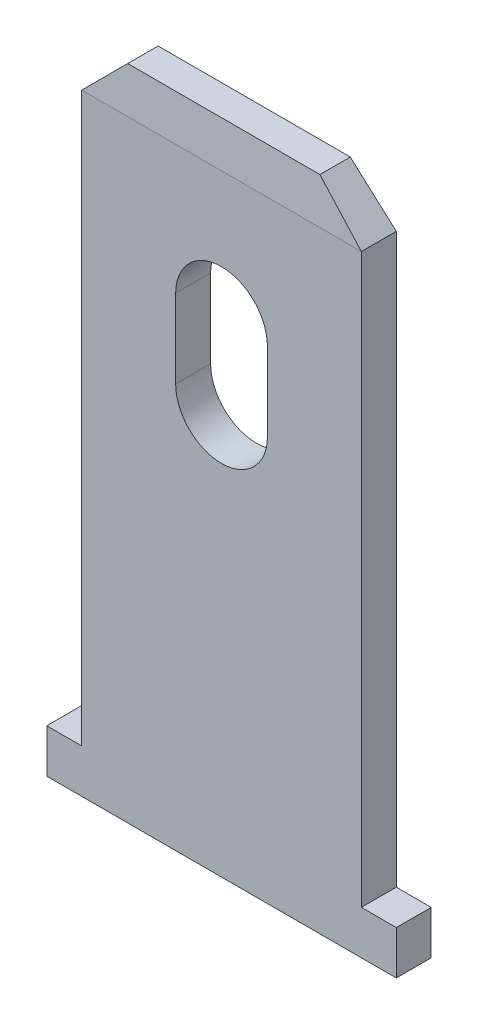
ISO-10303-21;
HEADER;
FILE_DESCRIPTION(('STEP AP214'),'2;1');
FILE_NAME('part.step','',(''),(''),'','','');
FILE_SCHEMA(('AUTOMOTIVE_DESIGN { 1 0 10303 214 1 1 1 1 }'));
ENDSEC;
DATA;
#1=APPLICATION_CONTEXT('core data for automotive mechanical design processes');
#2=APPLICATION_PROTOCOL_DEFINITION('international standard','automotive_design',2000,#1);
#3=PRODUCT_CONTEXT('',#1,'mechanical');
#4=PRODUCT('Part','Part','',(#3));
#5=PRODUCT_RELATED_PRODUCT_CATEGORY('part','',(#4));
#6=PRODUCT_DEFINITION_FORMATION('','',#4);
#7=PRODUCT_DEFINITION_CONTEXT('part definition',#1,'design');
#8=PRODUCT_DEFINITION('design','',#6,#7);
#9=PRODUCT_DEFINITION_SHAPE('','',#8);
#10=(LENGTH_UNIT() NAMED_UNIT(*) SI_UNIT(.MILLI.,.METRE.));
#11=(NAMED_UNIT(*) PLANE_ANGLE_UNIT() SI_UNIT($,.RADIAN.));
#12=(NAMED_UNIT(*) SI_UNIT($,.STERADIAN.) SOLID_ANGLE_UNIT());
#13=UNCERTAINTY_MEASURE_WITH_UNIT(LENGTH_MEASURE(1.E-05),#10,'distance_accuracy_value','');
#14=(GEOMETRIC_REPRESENTATION_CONTEXT(3) GLOBAL_UNCERTAINTY_ASSIGNED_CONTEXT((#13)) GLOBAL_UNIT_ASSIGNED_CONTEXT((#10,
#11,#12)) REPRESENTATION_CONTEXT('',''));
#15=CARTESIAN_POINT('',(0.,0.,0.));
#16=DIRECTION('',(0.,0.,1.));
#17=DIRECTION('',(1.,0.,0.));
#18=AXIS2_PLACEMENT_3D('',#15,#16,#17);
#19=CARTESIAN_POINT('',(0.,15.,-0.347592220716959));
#20=DIRECTION('',(0.,0.0523359562429405,-0.998629534754574));
#21=DIRECTION('',(0.,0.998629534754574,0.0523359562429405));
#22=AXIS2_PLACEMENT_3D('',#19,#20,#21);
#23=PLANE('',#22);
#24=DIRECTION('',(1.,0.,0.));
#25=VECTOR('',#24,1.);
#26=CARTESIAN_POINT('',(-4.,13.9999999999999,-0.4));
#27=LINE('',#26,#25);
#28=CARTESIAN_POINT('',(3.20000000000001,13.9999999999999,-0.4));
#29=VERTEX_POINT('',#28);
#30=CARTESIAN_POINT('',(-3.20000000000001,13.9999999999999,-0.4));
#31=VERTEX_POINT('',#30);
#32=EDGE_CURVE('E125',#29,#31,#27,.F.);
#33=ORIENTED_EDGE('',*,*,#32,.T.);
#34=DIRECTION('',(-0.706621750184623,-0.706621750184625,-0.037032476720271));
#35=VECTOR('',#34,1.);
#36=CARTESIAN_POINT('',(-2.2,15.,-0.347592220716959));
#37=LINE('',#36,#35);
#38=CARTESIAN_POINT('',(-2.2,15.,-0.347592220716959));
#39=VERTEX_POINT('',#38);
#40=EDGE_CURVE('E170',#39,#31,#37,.T.);
#41=ORIENTED_EDGE('',*,*,#40,.F.);
#42=DIRECTION('',(1.,0.,0.));
#43=VECTOR('',#42,1.);
#44=CARTESIAN_POINT('',(0.,15.,-0.347592220716959));
#45=LINE('',#44,#43);
#46=CARTESIAN_POINT('',(2.2,15.,-0.347592220716959));
#47=VERTEX_POINT('',#46);
#48=EDGE_CURVE('E145',#47,#39,#45,.F.);
#49=ORIENTED_EDGE('',*,*,#48,.F.);
#50=DIRECTION('',(-0.706621750184623,0.706621750184625,0.0370324767202709));
#51=VECTOR('',#50,1.);
#52=CARTESIAN_POINT('',(3.20000000000003,14.,-0.4));
#53=LINE('',#52,#51);
#54=EDGE_CURVE('E166',#29,#47,#53,.T.);
#55=ORIENTED_EDGE('',*,*,#54,.F.);
#56=EDGE_LOOP('',(#33,#41,#49,#55));
#57=FACE_BOUND('',#56,.T.);
#58=ADVANCED_FACE('F17',(#57),#23,.T.);
#59=CARTESIAN_POINT('',(0.,15.,0.));
#60=DIRECTION('',(0.,1.,0.));
#61=DIRECTION('',(0.,0.,1.));
#62=AXIS2_PLACEMENT_3D('',#59,#60,#61);
#63=PLANE('',#62);
#64=ORIENTED_EDGE('',*,*,#48,.T.);
#65=DIRECTION('',(0.,0.,1.));
#66=VECTOR('',#65,1.);
#67=CARTESIAN_POINT('',(-2.2,15.,0.));
#68=LINE('',#67,#66);
#69=CARTESIAN_POINT('',(-2.2,15.,0.347592220716959));
#70=VERTEX_POINT('',#69);
#71=EDGE_CURVE('E168',#70,#39,#68,.F.);
#72=ORIENTED_EDGE('',*,*,#71,.F.);
#73=DIRECTION('',(1.,0.,0.));
#74=VECTOR('',#73,1.);
#75=CARTESIAN_POINT('',(0.,15.,0.347592220716959));
#76=LINE('',#75,#74);
#77=CARTESIAN_POINT('',(2.2,15.,0.347592220716959));
#78=VERTEX_POINT('',#77);
#79=EDGE_CURVE('E259',#78,#70,#76,.F.);
#80=ORIENTED_EDGE('',*,*,#79,.F.);
#81=DIRECTION('',(0.,0.,1.));
#82=VECTOR('',#81,1.);
#83=CARTESIAN_POINT('',(2.2,15.,0.));
#84=LINE('',#83,#82);
#85=EDGE_CURVE('E164',#47,#78,#84,.T.);
#86=ORIENTED_EDGE('',*,*,#85,.F.);
#87=EDGE_LOOP('',(#64,#72,#80,#86));
#88=FACE_BOUND('',#87,.T.);
#89=ADVANCED_FACE('F178',(#88),#63,.T.);
#90=CARTESIAN_POINT('',(-2.2,15.,0.));
#91=DIRECTION('',(-0.707106781186549,0.707106781186546,0.));
#92=DIRECTION('',(-0.707106781186546,-0.707106781186549,0.));
#93=AXIS2_PLACEMENT_3D('',#90,#91,#92);
#94=PLANE('',#93);
#95=DIRECTION('',(-0.7066217501846,-0.706621750184648,0.0370324767202709));
#96=VECTOR('',#95,1.);
#97=CARTESIAN_POINT('',(-2.2,15.,0.347592220716959));
#98=LINE('',#97,#96);
#99=CARTESIAN_POINT('',(-3.20000000000001,14.,0.4));
#100=VERTEX_POINT('',#99);
#101=EDGE_CURVE('E184',#70,#100,#98,.T.);
#102=ORIENTED_EDGE('',*,*,#101,.F.);
#103=ORIENTED_EDGE('',*,*,#71,.T.);
#104=ORIENTED_EDGE('',*,*,#40,.T.);
#105=DIRECTION('',(0.,0.,-1.));
#106=VECTOR('',#105,1.);
#107=CARTESIAN_POINT('',(-3.2,13.9999999999999,-0.4));
#108=LINE('',#107,#106);
#109=EDGE_CURVE('E192',#31,#100,#108,.F.);
#110=ORIENTED_EDGE('',*,*,#109,.T.);
#111=EDGE_LOOP('',(#102,#103,#104,#110));
#112=FACE_BOUND('',#111,.T.);
#113=ADVANCED_FACE('F183',(#112),#94,.T.);
#114=CARTESIAN_POINT('',(2.2,15.,0.));
#115=DIRECTION('',(0.707106781186549,0.707106781186546,0.));
#116=DIRECTION('',(-0.707106781186546,0.707106781186549,0.));
#117=AXIS2_PLACEMENT_3D('',#114,#115,#116);
#118=PLANE('',#117);
#119=ORIENTED_EDGE('',*,*,#54,.T.);
#120=ORIENTED_EDGE('',*,*,#85,.T.);
#121=DIRECTION('',(-0.706621750184599,0.706621750184649,-0.037032476720271));
#122=VECTOR('',#121,1.);
#123=CARTESIAN_POINT('',(3.2,13.9999999999999,0.4));
#124=LINE('',#123,#122);
#125=CARTESIAN_POINT('',(3.20000000000002,13.9999999999999,0.4));
#126=VERTEX_POINT('',#125);
#127=EDGE_CURVE('E199',#126,#78,#124,.T.);
#128=ORIENTED_EDGE('',*,*,#127,.F.);
#129=DIRECTION('',(0.,0.,1.));
#130=VECTOR('',#129,1.);
#131=CARTESIAN_POINT('',(3.2,13.9999999999999,-0.4));
#132=LINE('',#131,#130);
#133=EDGE_CURVE('E34',#126,#29,#132,.F.);
#134=ORIENTED_EDGE('',*,*,#133,.T.);
#135=EDGE_LOOP('',(#119,#120,#128,#134));
#136=FACE_BOUND('',#135,.T.);
#137=ADVANCED_FACE('F265',(#136),#118,.T.);
#138=CARTESIAN_POINT('',(-4.,1.,-0.4));
#139=DIRECTION('',(0.,0.,1.));
#140=DIRECTION('',(1.,0.,0.));
#141=AXIS2_PLACEMENT_3D('',#138,#139,#140);
#142=PLANE('',#141);
#143=ORIENTED_EDGE('',*,*,#32,.F.);
#144=DIRECTION('',(0.,1.,0.));
#145=VECTOR('',#144,1.);
#146=CARTESIAN_POINT('',(3.2,15.,-0.4));
#147=LINE('',#146,#145);
#148=CARTESIAN_POINT('',(3.2,1.,-0.4));
#149=VERTEX_POINT('',#148);
#150=EDGE_CURVE('E155',#29,#149,#147,.F.);
#151=ORIENTED_EDGE('',*,*,#150,.T.);
#152=DIRECTION('',(1.,0.,0.));
#153=VECTOR('',#152,1.);
#154=CARTESIAN_POINT('',(0.,1.,-0.4));
#155=LINE('',#154,#153);
#156=CARTESIAN_POINT('',(4.,1.,-0.4));
#157=VERTEX_POINT('',#156);
#158=EDGE_CURVE('E138',#157,#149,#155,.F.);
#159=ORIENTED_EDGE('',*,*,#158,.F.);
#160=DIRECTION('',(0.,1.,0.));
#161=VECTOR('',#160,1.);
#162=CARTESIAN_POINT('',(4.,1.,-0.4));
#163=LINE('',#162,#161);
#164=CARTESIAN_POINT('',(4.,0.,-0.4));
#165=VERTEX_POINT('',#164);
#166=EDGE_CURVE('E222',#157,#165,#163,.F.);
#167=ORIENTED_EDGE('',*,*,#166,.T.);
#168=DIRECTION('',(1.,0.,0.));
#169=VECTOR('',#168,1.);
#170=CARTESIAN_POINT('',(0.,0.,-0.4));
#171=LINE('',#170,#169);
#172=CARTESIAN_POINT('',(-4.,0.,-0.4));
#173=VERTEX_POINT('',#172);
#174=EDGE_CURVE('E219',#165,#173,#171,.F.);
#175=ORIENTED_EDGE('',*,*,#174,.T.);
#176=DIRECTION('',(0.,1.,0.));
#177=VECTOR('',#176,1.);
#178=CARTESIAN_POINT('',(-4.,1.,-0.4));
#179=LINE('',#178,#177);
#180=CARTESIAN_POINT('',(-4.,1.,-0.4));
#181=VERTEX_POINT('',#180);
#182=EDGE_CURVE('E214',#173,#181,#179,.T.);
#183=ORIENTED_EDGE('',*,*,#182,.T.);
#184=DIRECTION('',(1.,0.,0.));
#185=VECTOR('',#184,1.);
#186=CARTESIAN_POINT('',(0.,1.,-0.4));
#187=LINE('',#186,#185);
#188=CARTESIAN_POINT('',(-3.2,1.,-0.4));
#189=VERTEX_POINT('',#188);
#190=EDGE_CURVE('E202',#189,#181,#187,.F.);
#191=ORIENTED_EDGE('',*,*,#190,.F.);
#192=DIRECTION('',(0.,1.,0.));
#193=VECTOR('',#192,1.);
#194=CARTESIAN_POINT('',(-3.2,15.,-0.4));
#195=LINE('',#194,#193);
#196=EDGE_CURVE('E194',#189,#31,#195,.T.);
#197=ORIENTED_EDGE('',*,*,#196,.T.);
#198=EDGE_LOOP('',(#143,#151,#159,#167,#175,#183,#191,#197));
#199=FACE_BOUND('',#198,.T.);
#200=CARTESIAN_POINT('',(0.,9.25,-0.4));
#201=DIRECTION('',(0.,0.,1.));
#202=DIRECTION('',(1.,0.,0.));
#203=AXIS2_PLACEMENT_3D('',#200,#201,#202);
#204=CIRCLE('',#203,1.05);
#205=CARTESIAN_POINT('',(-1.05,9.25,-0.4));
#206=VERTEX_POINT('',#205);
#207=CARTESIAN_POINT('',(1.05,9.25,-0.4));
#208=VERTEX_POINT('',#207);
#209=EDGE_CURVE('E134',#206,#208,#204,.T.);
#210=ORIENTED_EDGE('',*,*,#209,.T.);
#211=DIRECTION('',(0.,1.,0.));
#212=VECTOR('',#211,1.);
#213=CARTESIAN_POINT('',(1.05,11.05,-0.4));
#214=LINE('',#213,#212);
#215=CARTESIAN_POINT('',(1.05,11.05,-0.4));
#216=VERTEX_POINT('',#215);
#217=EDGE_CURVE('E129',#208,#216,#214,.T.);
#218=ORIENTED_EDGE('',*,*,#217,.T.);
#219=CARTESIAN_POINT('',(0.,11.05,-0.4));
#220=DIRECTION('',(0.,0.,1.));
#221=DIRECTION('',(1.,0.,0.));
#222=AXIS2_PLACEMENT_3D('',#219,#220,#221);
#223=CIRCLE('',#222,1.05);
#224=CARTESIAN_POINT('',(-1.05,11.05,-0.4));
#225=VERTEX_POINT('',#224);
#226=EDGE_CURVE('E20',#216,#225,#223,.T.);
#227=ORIENTED_EDGE('',*,*,#226,.T.);
#228=DIRECTION('',(0.,1.,0.));
#229=VECTOR('',#228,1.);
#230=CARTESIAN_POINT('',(-1.05,11.05,-0.4));
#231=LINE('',#230,#229);
#232=EDGE_CURVE('E147',#225,#206,#231,.F.);
#233=ORIENTED_EDGE('',*,*,#232,.T.);
#234=EDGE_LOOP('',(#210,#218,#227,#233));
#235=FACE_BOUND('',#234,.T.);
#236=ADVANCED_FACE('F136',(#199,#235),#142,.F.);
#237=CARTESIAN_POINT('',(0.,11.05,-0.40105));
#238=DIRECTION('',(0.,0.,1.));
#239=DIRECTION('',(1.,0.,0.));
#240=AXIS2_PLACEMENT_3D('',#237,#238,#239);
#241=CYLINDRICAL_SURFACE('',#240,1.05);
#242=DIRECTION('',(0.,0.,1.));
#243=VECTOR('',#242,1.);
#244=CARTESIAN_POINT('',(1.05,11.05,-0.40105));
#245=LINE('',#244,#243);
#246=CARTESIAN_POINT('',(1.05,11.05,0.4));
#247=VERTEX_POINT('',#246);
#248=EDGE_CURVE('E119',#216,#247,#245,.T.);
#249=ORIENTED_EDGE('',*,*,#248,.T.);
#250=CARTESIAN_POINT('',(0.,11.05,0.4));
#251=DIRECTION('',(0.,0.,1.));
#252=DIRECTION('',(1.,0.,0.));
#253=AXIS2_PLACEMENT_3D('',#250,#251,#252);
#254=CIRCLE('',#253,1.05);
#255=CARTESIAN_POINT('',(-1.05,11.05,0.4));
#256=VERTEX_POINT('',#255);
#257=EDGE_CURVE('E154',#247,#256,#254,.T.);
#258=ORIENTED_EDGE('',*,*,#257,.T.);
#259=DIRECTION('',(0.,0.,1.));
#260=VECTOR('',#259,1.);
#261=CARTESIAN_POINT('',(-1.05,11.05,-0.40105));
#262=LINE('',#261,#260);
#263=EDGE_CURVE('E121',#256,#225,#262,.F.);
#264=ORIENTED_EDGE('',*,*,#263,.T.);
#265=ORIENTED_EDGE('',*,*,#226,.F.);
#266=EDGE_LOOP('',(#249,#258,#264,#265));
#267=FACE_BOUND('',#266,.T.);
#268=ADVANCED_FACE('F117',(#267),#241,.F.);
#269=CARTESIAN_POINT('',(-1.05,11.05,-0.40105));
#270=DIRECTION('',(-1.,0.,0.));
#271=DIRECTION('',(0.,0.,1.));
#272=AXIS2_PLACEMENT_3D('',#269,#270,#271);
#273=PLANE('',#272);
#274=ORIENTED_EDGE('',*,*,#263,.F.);
#275=DIRECTION('',(0.,1.,0.));
#276=VECTOR('',#275,1.);
#277=CARTESIAN_POINT('',(-1.05,1.,0.4));
#278=LINE('',#277,#276);
#279=CARTESIAN_POINT('',(-1.05,9.25,0.4));
#280=VERTEX_POINT('',#279);
#281=EDGE_CURVE('E153',#256,#280,#278,.F.);
#282=ORIENTED_EDGE('',*,*,#281,.T.);
#283=DIRECTION('',(0.,0.,1.));
#284=VECTOR('',#283,1.);
#285=CARTESIAN_POINT('',(-1.05,9.25,-0.40105));
#286=LINE('',#285,#284);
#287=EDGE_CURVE('E149',#280,#206,#286,.F.);
#288=ORIENTED_EDGE('',*,*,#287,.T.);
#289=ORIENTED_EDGE('',*,*,#232,.F.);
#290=EDGE_LOOP('',(#274,#282,#288,#289));
#291=FACE_BOUND('',#290,.T.);
#292=ADVANCED_FACE('F371',(#291),#273,.F.);
#293=CARTESIAN_POINT('',(0.,9.25,-0.40105));
#294=DIRECTION('',(0.,0.,1.));
#295=DIRECTION('',(1.,0.,0.));
#296=AXIS2_PLACEMENT_3D('',#293,#294,#295);
#297=CYLINDRICAL_SURFACE('',#296,1.05);
#298=ORIENTED_EDGE('',*,*,#287,.F.);
#299=CARTESIAN_POINT('',(0.,9.25,0.4));
#300=DIRECTION('',(0.,0.,1.));
#301=DIRECTION('',(1.,0.,0.));
#302=AXIS2_PLACEMENT_3D('',#299,#300,#301);
#303=CIRCLE('',#302,1.05);
#304=CARTESIAN_POINT('',(1.05,9.25,0.4));
#305=VERTEX_POINT('',#304);
#306=EDGE_CURVE('E150',#280,#305,#303,.T.);
#307=ORIENTED_EDGE('',*,*,#306,.T.);
#308=DIRECTION('',(0.,0.,1.));
#309=VECTOR('',#308,1.);
#310=CARTESIAN_POINT('',(1.05,9.25,-0.40105));
#311=LINE('',#310,#309);
#312=EDGE_CURVE('E133',#305,#208,#311,.F.);
#313=ORIENTED_EDGE('',*,*,#312,.T.);
#314=ORIENTED_EDGE('',*,*,#209,.F.);
#315=EDGE_LOOP('',(#298,#307,#313,#314));
#316=FACE_BOUND('',#315,.T.);
#317=ADVANCED_FACE('F363',(#316),#297,.F.);
#318=CARTESIAN_POINT('',(1.05,11.05,-0.40105));
#319=DIRECTION('',(1.,0.,0.));
#320=DIRECTION('',(0.,1.,0.));
#321=AXIS2_PLACEMENT_3D('',#318,#319,#320);
#322=PLANE('',#321);
#323=ORIENTED_EDGE('',*,*,#312,.F.);
#324=DIRECTION('',(0.,1.,0.));
#325=VECTOR('',#324,1.);
#326=CARTESIAN_POINT('',(1.05,1.,0.4));
#327=LINE('',#326,#325);
#328=EDGE_CURVE('E132',#305,#247,#327,.T.);
#329=ORIENTED_EDGE('',*,*,#328,.T.);
#330=ORIENTED_EDGE('',*,*,#248,.F.);
#331=ORIENTED_EDGE('',*,*,#217,.F.);
#332=EDGE_LOOP('',(#323,#329,#330,#331));
#333=FACE_BOUND('',#332,.T.);
#334=ADVANCED_FACE('F128',(#333),#322,.F.);
#335=CARTESIAN_POINT('',(0.,1.,0.));
#336=DIRECTION('',(0.,1.,0.));
#337=DIRECTION('',(0.,0.,1.));
#338=AXIS2_PLACEMENT_3D('',#335,#336,#337);
#339=PLANE('',#338);
#340=DIRECTION('',(0.,0.,1.));
#341=VECTOR('',#340,1.);
#342=CARTESIAN_POINT('',(4.,1.,-0.4));
#343=LINE('',#342,#341);
#344=CARTESIAN_POINT('',(4.,1.,0.4));
#345=VERTEX_POINT('',#344);
#346=EDGE_CURVE('E140',#345,#157,#343,.F.);
#347=ORIENTED_EDGE('',*,*,#346,.T.);
#348=ORIENTED_EDGE('',*,*,#158,.T.);
#349=DIRECTION('',(0.,0.,1.));
#350=VECTOR('',#349,1.);
#351=CARTESIAN_POINT('',(3.2,1.,-0.4));
#352=LINE('',#351,#350);
#353=CARTESIAN_POINT('',(3.2,1.,0.4));
#354=VERTEX_POINT('',#353);
#355=EDGE_CURVE('E256',#149,#354,#352,.T.);
#356=ORIENTED_EDGE('',*,*,#355,.T.);
#357=DIRECTION('',(-1.,0.,0.));
#358=VECTOR('',#357,1.);
#359=CARTESIAN_POINT('',(-4.,1.,0.4));
#360=LINE('',#359,#358);
#361=EDGE_CURVE('E231',#354,#345,#360,.F.);
#362=ORIENTED_EDGE('',*,*,#361,.T.);
#363=EDGE_LOOP('',(#347,#348,#356,#362));
#364=FACE_BOUND('',#363,.T.);
#365=ADVANCED_FACE('F228',(#364),#339,.T.);
#366=CARTESIAN_POINT('',(4.,1.,-0.4));
#367=DIRECTION('',(-1.,0.,0.));
#368=DIRECTION('',(0.,0.,1.));
#369=AXIS2_PLACEMENT_3D('',#366,#367,#368);
#370=PLANE('',#369);
#371=ORIENTED_EDGE('',*,*,#166,.F.);
#372=ORIENTED_EDGE('',*,*,#346,.F.);
#373=DIRECTION('',(0.,1.,0.));
#374=VECTOR('',#373,1.);
#375=CARTESIAN_POINT('',(4.,1.,0.4));
#376=LINE('',#375,#374);
#377=CARTESIAN_POINT('',(4.,0.,0.4));
#378=VERTEX_POINT('',#377);
#379=EDGE_CURVE('E237',#345,#378,#376,.F.);
#380=ORIENTED_EDGE('',*,*,#379,.T.);
#381=DIRECTION('',(0.,0.,1.));
#382=VECTOR('',#381,1.);
#383=CARTESIAN_POINT('',(4.,0.,0.));
#384=LINE('',#383,#382);
#385=EDGE_CURVE('E216',#378,#165,#384,.F.);
#386=ORIENTED_EDGE('',*,*,#385,.T.);
#387=EDGE_LOOP('',(#371,#372,#380,#386));
#388=FACE_BOUND('',#387,.T.);
#389=ADVANCED_FACE('F236',(#388),#370,.F.);
#390=CARTESIAN_POINT('',(0.,0.,0.));
#391=DIRECTION('',(0.,1.,0.));
#392=DIRECTION('',(0.,0.,1.));
#393=AXIS2_PLACEMENT_3D('',#390,#391,#392);
#394=PLANE('',#393);
#395=DIRECTION('',(-1.,0.,0.));
#396=VECTOR('',#395,1.);
#397=CARTESIAN_POINT('',(-4.,0.,0.4));
#398=LINE('',#397,#396);
#399=CARTESIAN_POINT('',(-4.,0.,0.4));
#400=VERTEX_POINT('',#399);
#401=EDGE_CURVE('E245',#378,#400,#398,.T.);
#402=ORIENTED_EDGE('',*,*,#401,.T.);
#403=DIRECTION('',(0.,0.,-1.));
#404=VECTOR('',#403,1.);
#405=CARTESIAN_POINT('',(-4.,0.,-0.4));
#406=LINE('',#405,#404);
#407=EDGE_CURVE('E211',#400,#173,#406,.T.);
#408=ORIENTED_EDGE('',*,*,#407,.T.);
#409=ORIENTED_EDGE('',*,*,#174,.F.);
#410=ORIENTED_EDGE('',*,*,#385,.F.);
#411=EDGE_LOOP('',(#402,#408,#409,#410));
#412=FACE_BOUND('',#411,.T.);
#413=ADVANCED_FACE('F268',(#412),#394,.F.);
#414=CARTESIAN_POINT('',(-4.,1.,-0.4));
#415=DIRECTION('',(1.,0.,0.));
#416=DIRECTION('',(0.,0.,-1.));
#417=AXIS2_PLACEMENT_3D('',#414,#415,#416);
#418=PLANE('',#417);
#419=DIRECTION('',(0.,1.,0.));
#420=VECTOR('',#419,1.);
#421=CARTESIAN_POINT('',(-4.,1.,0.4));
#422=LINE('',#421,#420);
#423=CARTESIAN_POINT('',(-4.,1.,0.4));
#424=VERTEX_POINT('',#423);
#425=EDGE_CURVE('E247',#400,#424,#422,.T.);
#426=ORIENTED_EDGE('',*,*,#425,.T.);
#427=DIRECTION('',(0.,0.,1.));
#428=VECTOR('',#427,1.);
#429=CARTESIAN_POINT('',(-4.,1.,0.));
#430=LINE('',#429,#428);
#431=EDGE_CURVE('E205',#181,#424,#430,.T.);
#432=ORIENTED_EDGE('',*,*,#431,.F.);
#433=ORIENTED_EDGE('',*,*,#182,.F.);
#434=ORIENTED_EDGE('',*,*,#407,.F.);
#435=EDGE_LOOP('',(#426,#432,#433,#434));
#436=FACE_BOUND('',#435,.T.);
#437=ADVANCED_FACE('F271',(#436),#418,.F.);
#438=CARTESIAN_POINT('',(0.,1.,0.));
#439=DIRECTION('',(0.,1.,0.));
#440=DIRECTION('',(0.,0.,1.));
#441=AXIS2_PLACEMENT_3D('',#438,#439,#440);
#442=PLANE('',#441);
#443=ORIENTED_EDGE('',*,*,#431,.T.);
#444=DIRECTION('',(-1.,0.,0.));
#445=VECTOR('',#444,1.);
#446=CARTESIAN_POINT('',(-4.,1.,0.4));
#447=LINE('',#446,#445);
#448=CARTESIAN_POINT('',(-3.2,1.,0.4));
#449=VERTEX_POINT('',#448);
#450=EDGE_CURVE('E275',#424,#449,#447,.F.);
#451=ORIENTED_EDGE('',*,*,#450,.T.);
#452=DIRECTION('',(0.,0.,-1.));
#453=VECTOR('',#452,1.);
#454=CARTESIAN_POINT('',(-3.2,1.,-0.4));
#455=LINE('',#454,#453);
#456=EDGE_CURVE('E203',#449,#189,#455,.T.);
#457=ORIENTED_EDGE('',*,*,#456,.T.);
#458=ORIENTED_EDGE('',*,*,#190,.T.);
#459=EDGE_LOOP('',(#443,#451,#457,#458));
#460=FACE_BOUND('',#459,.T.);
#461=ADVANCED_FACE('F280',(#460),#442,.T.);
#462=CARTESIAN_POINT('',(-3.2,15.,-0.4));
#463=DIRECTION('',(1.,0.,0.));
#464=DIRECTION('',(0.,0.,-1.));
#465=AXIS2_PLACEMENT_3D('',#462,#463,#464);
#466=PLANE('',#465);
#467=ORIENTED_EDGE('',*,*,#109,.F.);
#468=ORIENTED_EDGE('',*,*,#196,.F.);
#469=ORIENTED_EDGE('',*,*,#456,.F.);
#470=DIRECTION('',(0.,1.,0.));
#471=VECTOR('',#470,1.);
#472=CARTESIAN_POINT('',(-3.2,1.,0.4));
#473=LINE('',#472,#471);
#474=EDGE_CURVE('E197',#449,#100,#473,.T.);
#475=ORIENTED_EDGE('',*,*,#474,.T.);
#476=EDGE_LOOP('',(#467,#468,#469,#475));
#477=FACE_BOUND('',#476,.T.);
#478=ADVANCED_FACE('F193',(#477),#466,.F.);
#479=CARTESIAN_POINT('',(0.,15.,0.347592220716959));
#480=DIRECTION('',(0.,0.0523359562429405,0.998629534754574));
#481=DIRECTION('',(0.,-0.998629534754574,0.0523359562429405));
#482=AXIS2_PLACEMENT_3D('',#479,#480,#481);
#483=PLANE('',#482);
#484=ORIENTED_EDGE('',*,*,#79,.T.);
#485=ORIENTED_EDGE('',*,*,#101,.T.);
#486=DIRECTION('',(-1.,0.,0.));
#487=VECTOR('',#486,1.);
#488=CARTESIAN_POINT('',(-4.,13.9999999999999,0.4));
#489=LINE('',#488,#487);
#490=EDGE_CURVE('E26',#100,#126,#489,.F.);
#491=ORIENTED_EDGE('',*,*,#490,.T.);
#492=ORIENTED_EDGE('',*,*,#127,.T.);
#493=EDGE_LOOP('',(#484,#485,#491,#492));
#494=FACE_BOUND('',#493,.T.);
#495=ADVANCED_FACE('F263',(#494),#483,.T.);
#496=CARTESIAN_POINT('',(3.2,15.,-0.4));
#497=DIRECTION('',(-1.,0.,0.));
#498=DIRECTION('',(0.,0.,1.));
#499=AXIS2_PLACEMENT_3D('',#496,#497,#498);
#500=PLANE('',#499);
#501=ORIENTED_EDGE('',*,*,#133,.F.);
#502=DIRECTION('',(0.,1.,0.));
#503=VECTOR('',#502,1.);
#504=CARTESIAN_POINT('',(3.2,1.,0.4));
#505=LINE('',#504,#503);
#506=EDGE_CURVE('E11',#126,#354,#505,.F.);
#507=ORIENTED_EDGE('',*,*,#506,.T.);
#508=ORIENTED_EDGE('',*,*,#355,.F.);
#509=ORIENTED_EDGE('',*,*,#150,.F.);
#510=EDGE_LOOP('',(#501,#507,#508,#509));
#511=FACE_BOUND('',#510,.T.);
#512=ADVANCED_FACE('F266',(#511),#500,.F.);
#513=CARTESIAN_POINT('',(-4.,1.,0.4));
#514=DIRECTION('',(0.,0.,-1.));
#515=DIRECTION('',(-1.,0.,0.));
#516=AXIS2_PLACEMENT_3D('',#513,#514,#515);
#517=PLANE('',#516);
#518=ORIENTED_EDGE('',*,*,#490,.F.);
#519=ORIENTED_EDGE('',*,*,#474,.F.);
#520=ORIENTED_EDGE('',*,*,#450,.F.);
#521=ORIENTED_EDGE('',*,*,#425,.F.);
#522=ORIENTED_EDGE('',*,*,#401,.F.);
#523=ORIENTED_EDGE('',*,*,#379,.F.);
#524=ORIENTED_EDGE('',*,*,#361,.F.);
#525=ORIENTED_EDGE('',*,*,#506,.F.);
#526=EDGE_LOOP('',(#518,#519,#520,#521,#522,#523,#524,#525));
#527=FACE_BOUND('',#526,.T.);
#528=ORIENTED_EDGE('',*,*,#306,.F.);
#529=ORIENTED_EDGE('',*,*,#281,.F.);
#530=ORIENTED_EDGE('',*,*,#257,.F.);
#531=ORIENTED_EDGE('',*,*,#328,.F.);
#532=EDGE_LOOP('',(#528,#529,#530,#531));
#533=FACE_BOUND('',#532,.T.);
#534=ADVANCED_FACE('F240',(#527,#533),#517,.F.);
#535=CLOSED_SHELL('',(#58,#89,#113,#137,#236,#268,#292,#317,#334,#365,#389,#413,#437,#461,#478,
#495,#512,#534));
#536=MANIFOLD_SOLID_BREP('B1',#535);
#537=ADVANCED_BREP_SHAPE_REPRESENTATION('',(#18,#536),#14);
#538=SHAPE_DEFINITION_REPRESENTATION(#9,#537);
ENDSEC;
END-ISO-10303-21;
